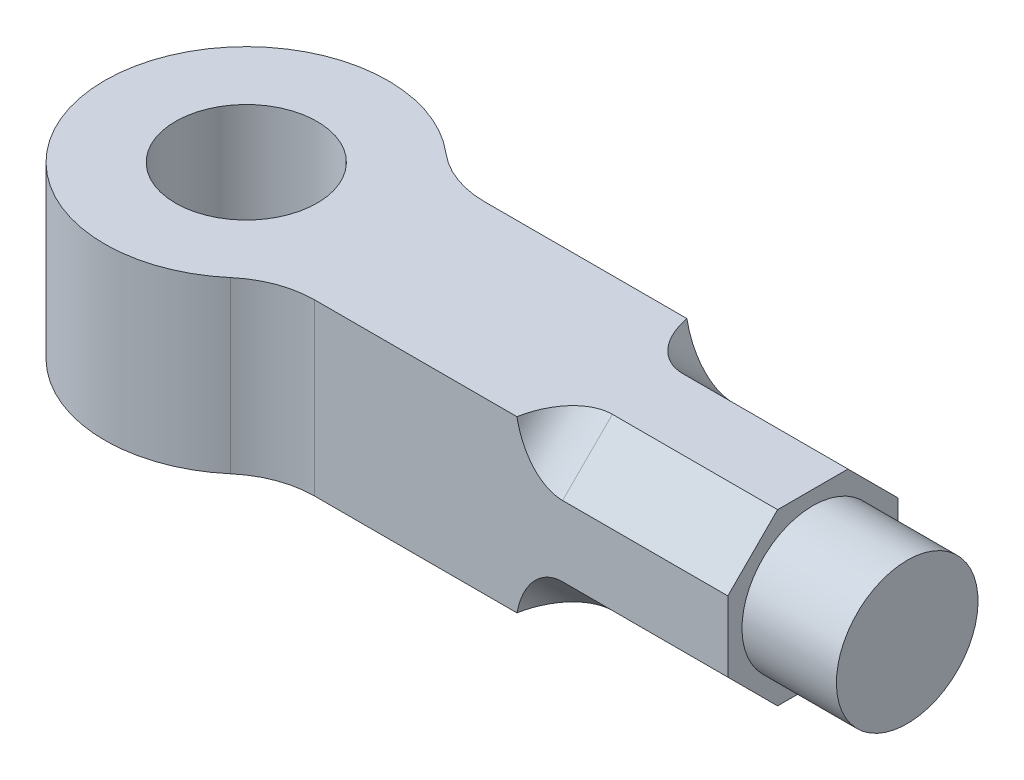
ISO-10303-21;
HEADER;
FILE_DESCRIPTION(('STEP AP214'),'2;1');
FILE_NAME('part.step','',(''),(''),'','','');
FILE_SCHEMA(('AUTOMOTIVE_DESIGN { 1 0 10303 214 1 1 1 1 }'));
ENDSEC;
DATA;
#1=APPLICATION_CONTEXT('core data for automotive mechanical design processes');
#2=APPLICATION_PROTOCOL_DEFINITION('international standard','automotive_design',2000,#1);
#3=PRODUCT_CONTEXT('',#1,'mechanical');
#4=PRODUCT('Part','Part','',(#3));
#5=PRODUCT_RELATED_PRODUCT_CATEGORY('part','',(#4));
#6=PRODUCT_DEFINITION_FORMATION('','',#4);
#7=PRODUCT_DEFINITION_CONTEXT('part definition',#1,'design');
#8=PRODUCT_DEFINITION('design','',#6,#7);
#9=PRODUCT_DEFINITION_SHAPE('','',#8);
#10=(LENGTH_UNIT() NAMED_UNIT(*) SI_UNIT(.MILLI.,.METRE.));
#11=(NAMED_UNIT(*) PLANE_ANGLE_UNIT() SI_UNIT($,.RADIAN.));
#12=(NAMED_UNIT(*) SI_UNIT($,.STERADIAN.) SOLID_ANGLE_UNIT());
#13=UNCERTAINTY_MEASURE_WITH_UNIT(LENGTH_MEASURE(1.E-05),#10,'distance_accuracy_value','');
#14=(GEOMETRIC_REPRESENTATION_CONTEXT(3) GLOBAL_UNCERTAINTY_ASSIGNED_CONTEXT((#13)) GLOBAL_UNIT_ASSIGNED_CONTEXT((#10,
#11,#12)) REPRESENTATION_CONTEXT('',''));
#15=CARTESIAN_POINT('',(0.,0.,0.));
#16=DIRECTION('',(0.,0.,1.));
#17=DIRECTION('',(1.,0.,0.));
#18=AXIS2_PLACEMENT_3D('',#15,#16,#17);
#19=CARTESIAN_POINT('',(0.,18.,0.));
#20=DIRECTION('',(0.,1.,0.));
#21=DIRECTION('',(0.,0.,1.));
#22=AXIS2_PLACEMENT_3D('',#19,#20,#21);
#23=PLANE('',#22);
#24=CARTESIAN_POINT('',(0.,18.,0.));
#25=DIRECTION('',(0.,1.,0.));
#26=DIRECTION('',(0.,0.,1.));
#27=AXIS2_PLACEMENT_3D('',#24,#25,#26);
#28=CIRCLE('',#27,30.);
#29=CARTESIAN_POINT('',(19.4976921711263,18.,-22.8));
#30=VERTEX_POINT('',#29);
#31=CARTESIAN_POINT('',(19.4976921711263,18.,22.8));
#32=VERTEX_POINT('',#31);
#33=EDGE_CURVE('E182',#30,#32,#28,.T.);
#34=ORIENTED_EDGE('',*,*,#33,.T.);
#35=CARTESIAN_POINT('',(32.4961536185439,18.,38.));
#36=DIRECTION('',(0.,1.,0.));
#37=DIRECTION('',(0.,0.,1.));
#38=AXIS2_PLACEMENT_3D('',#35,#36,#37);
#39=CIRCLE('',#38,20.);
#40=CARTESIAN_POINT('',(32.4961536185439,18.,18.));
#41=VERTEX_POINT('',#40);
#42=EDGE_CURVE('E234',#32,#41,#39,.F.);
#43=ORIENTED_EDGE('',*,*,#42,.T.);
#44=DIRECTION('',(1.,0.,0.));
#45=VECTOR('',#44,1.);
#46=CARTESIAN_POINT('',(24.,18.,18.));
#47=LINE('',#46,#45);
#48=CARTESIAN_POINT('',(75.3290501566764,18.,18.));
#49=VERTEX_POINT('',#48);
#50=EDGE_CURVE('E186',#41,#49,#47,.T.);
#51=ORIENTED_EDGE('',*,*,#50,.T.);
#52=CARTESIAN_POINT('',(85.,18.,21.5979797464467));
#53=DIRECTION('',(0.,1.,0.));
#54=DIRECTION('',(0.,0.,-1.));
#55=AXIS2_PLACEMENT_3D('',#52,#53,#54);
#56=ELLIPSE('',#55,14.1421356237309,10.);
#57=CARTESIAN_POINT('',(85.,18.,7.45584412271579));
#58=VERTEX_POINT('',#57);
#59=EDGE_CURVE('E221',#49,#58,#56,.F.);
#60=ORIENTED_EDGE('',*,*,#59,.T.);
#61=DIRECTION('',(-1.,0.,0.));
#62=VECTOR('',#61,1.);
#63=CARTESIAN_POINT('',(120.,18.,7.4558441227158));
#64=LINE('',#63,#62);
#65=CARTESIAN_POINT('',(120.,18.,7.4558441227158));
#66=VERTEX_POINT('',#65);
#67=EDGE_CURVE('E299',#66,#58,#64,.T.);
#68=ORIENTED_EDGE('',*,*,#67,.F.);
#69=DIRECTION('',(0.,0.,1.));
#70=VECTOR('',#69,1.);
#71=CARTESIAN_POINT('',(120.,18.0000000000001,-7.45584412271558));
#72=LINE('',#71,#70);
#73=CARTESIAN_POINT('',(120.,18.0000000000001,-7.45584412271558));
#74=VERTEX_POINT('',#73);
#75=EDGE_CURVE('E303',#74,#66,#72,.T.);
#76=ORIENTED_EDGE('',*,*,#75,.F.);
#77=DIRECTION('',(-1.,0.,0.));
#78=VECTOR('',#77,1.);
#79=CARTESIAN_POINT('',(120.,18.0000000000001,-7.45584412271558));
#80=LINE('',#79,#78);
#81=CARTESIAN_POINT('',(85.,18.0000000000001,-7.45584412271559));
#82=VERTEX_POINT('',#81);
#83=EDGE_CURVE('E301',#74,#82,#80,.T.);
#84=ORIENTED_EDGE('',*,*,#83,.T.);
#85=CARTESIAN_POINT('',(85.,18.,-21.5979797464467));
#86=DIRECTION('',(0.,1.,0.));
#87=DIRECTION('',(0.,0.,-1.));
#88=AXIS2_PLACEMENT_3D('',#85,#86,#87);
#89=ELLIPSE('',#88,14.142135623731,10.);
#90=CARTESIAN_POINT('',(75.3290501566765,18.,-18.));
#91=VERTEX_POINT('',#90);
#92=EDGE_CURVE('E213',#82,#91,#89,.F.);
#93=ORIENTED_EDGE('',*,*,#92,.T.);
#94=DIRECTION('',(-1.,0.,0.));
#95=VECTOR('',#94,1.);
#96=CARTESIAN_POINT('',(24.,18.,-18.));
#97=LINE('',#96,#95);
#98=CARTESIAN_POINT('',(32.4961536185438,18.,-18.));
#99=VERTEX_POINT('',#98);
#100=EDGE_CURVE('E180',#91,#99,#97,.T.);
#101=ORIENTED_EDGE('',*,*,#100,.T.);
#102=CARTESIAN_POINT('',(32.4961536185438,18.,-38.));
#103=DIRECTION('',(0.,1.,0.));
#104=DIRECTION('',(0.,0.,1.));
#105=AXIS2_PLACEMENT_3D('',#102,#103,#104);
#106=CIRCLE('',#105,20.);
#107=EDGE_CURVE('E43',#99,#30,#106,.F.);
#108=ORIENTED_EDGE('',*,*,#107,.T.);
#109=EDGE_LOOP('',(#34,#43,#51,#60,#68,#76,#84,#93,#101,#108));
#110=FACE_BOUND('',#109,.T.);
#111=CARTESIAN_POINT('',(0.,18.,0.));
#112=DIRECTION('',(0.,1.,0.));
#113=DIRECTION('',(0.,0.,1.));
#114=AXIS2_PLACEMENT_3D('',#111,#112,#113);
#115=CIRCLE('',#114,15.);
#116=CARTESIAN_POINT('',(0.,18.,15.));
#117=VERTEX_POINT('',#116);
#118=EDGE_CURVE('E171',#117,#117,#115,.T.);
#119=ORIENTED_EDGE('',*,*,#118,.F.);
#120=EDGE_LOOP('',(#119));
#121=FACE_BOUND('',#120,.T.);
#122=ADVANCED_FACE('F39',(#110,#121),#23,.T.);
#123=CARTESIAN_POINT('',(0.,-18.,0.));
#124=DIRECTION('',(0.,1.,0.));
#125=DIRECTION('',(0.,0.,1.));
#126=AXIS2_PLACEMENT_3D('',#123,#124,#125);
#127=PLANE('',#126);
#128=DIRECTION('',(-1.,0.,0.));
#129=VECTOR('',#128,1.);
#130=CARTESIAN_POINT('',(120.,-18.,7.45584412271571));
#131=LINE('',#130,#129);
#132=CARTESIAN_POINT('',(120.,-18.,7.45584412271571));
#133=VERTEX_POINT('',#132);
#134=CARTESIAN_POINT('',(85.,-18.,7.4558441227157));
#135=VERTEX_POINT('',#134);
#136=EDGE_CURVE('E149',#133,#135,#131,.T.);
#137=ORIENTED_EDGE('',*,*,#136,.T.);
#138=CARTESIAN_POINT('',(85.,-18.,21.5979797464467));
#139=DIRECTION('',(0.,1.,0.));
#140=DIRECTION('',(0.,0.,1.));
#141=AXIS2_PLACEMENT_3D('',#138,#139,#140);
#142=ELLIPSE('',#141,14.142135623731,10.);
#143=CARTESIAN_POINT('',(75.3290501566765,-18.,18.));
#144=VERTEX_POINT('',#143);
#145=EDGE_CURVE('E204',#135,#144,#142,.T.);
#146=ORIENTED_EDGE('',*,*,#145,.T.);
#147=DIRECTION('',(1.,0.,0.));
#148=VECTOR('',#147,1.);
#149=CARTESIAN_POINT('',(24.,-18.,18.));
#150=LINE('',#149,#148);
#151=CARTESIAN_POINT('',(32.4961536185439,-18.,18.));
#152=VERTEX_POINT('',#151);
#153=EDGE_CURVE('E183',#152,#144,#150,.T.);
#154=ORIENTED_EDGE('',*,*,#153,.F.);
#155=CARTESIAN_POINT('',(32.4961536185439,-18.,38.));
#156=DIRECTION('',(0.,1.,0.));
#157=DIRECTION('',(0.,0.,1.));
#158=AXIS2_PLACEMENT_3D('',#155,#156,#157);
#159=CIRCLE('',#158,20.);
#160=CARTESIAN_POINT('',(19.4976921711263,-18.,22.8));
#161=VERTEX_POINT('',#160);
#162=EDGE_CURVE('E232',#152,#161,#159,.T.);
#163=ORIENTED_EDGE('',*,*,#162,.T.);
#164=CARTESIAN_POINT('',(0.,-18.,0.));
#165=DIRECTION('',(0.,1.,0.));
#166=DIRECTION('',(0.,0.,1.));
#167=AXIS2_PLACEMENT_3D('',#164,#165,#166);
#168=CIRCLE('',#167,30.);
#169=CARTESIAN_POINT('',(19.4976921711263,-18.,-22.8));
#170=VERTEX_POINT('',#169);
#171=EDGE_CURVE('E190',#170,#161,#168,.T.);
#172=ORIENTED_EDGE('',*,*,#171,.F.);
#173=CARTESIAN_POINT('',(32.4961536185438,-18.,-38.));
#174=DIRECTION('',(0.,1.,0.));
#175=DIRECTION('',(0.,0.,1.));
#176=AXIS2_PLACEMENT_3D('',#173,#174,#175);
#177=CIRCLE('',#176,20.);
#178=CARTESIAN_POINT('',(32.4961536185438,-18.,-18.));
#179=VERTEX_POINT('',#178);
#180=EDGE_CURVE('E63',#170,#179,#177,.T.);
#181=ORIENTED_EDGE('',*,*,#180,.T.);
#182=DIRECTION('',(-1.,0.,0.));
#183=VECTOR('',#182,1.);
#184=CARTESIAN_POINT('',(24.,-18.,-18.));
#185=LINE('',#184,#183);
#186=CARTESIAN_POINT('',(75.3290501566765,-18.,-18.));
#187=VERTEX_POINT('',#186);
#188=EDGE_CURVE('E178',#187,#179,#185,.T.);
#189=ORIENTED_EDGE('',*,*,#188,.F.);
#190=CARTESIAN_POINT('',(85.,-18.,-21.5979797464466));
#191=DIRECTION('',(0.,1.,0.));
#192=DIRECTION('',(0.,0.,1.));
#193=AXIS2_PLACEMENT_3D('',#190,#191,#192);
#194=ELLIPSE('',#193,14.1421356237309,10.);
#195=CARTESIAN_POINT('',(85.,-18.,-7.45584412271578));
#196=VERTEX_POINT('',#195);
#197=EDGE_CURVE('E211',#187,#196,#194,.T.);
#198=ORIENTED_EDGE('',*,*,#197,.T.);
#199=DIRECTION('',(-1.,0.,0.));
#200=VECTOR('',#199,1.);
#201=CARTESIAN_POINT('',(120.,-18.,-7.45584412271576));
#202=LINE('',#201,#200);
#203=CARTESIAN_POINT('',(120.,-18.,-7.45584412271576));
#204=VERTEX_POINT('',#203);
#205=EDGE_CURVE('E173',#204,#196,#202,.T.);
#206=ORIENTED_EDGE('',*,*,#205,.F.);
#207=DIRECTION('',(0.,0.,-1.));
#208=VECTOR('',#207,1.);
#209=CARTESIAN_POINT('',(120.,-18.,7.45584412271571));
#210=LINE('',#209,#208);
#211=EDGE_CURVE('E152',#133,#204,#210,.T.);
#212=ORIENTED_EDGE('',*,*,#211,.F.);
#213=EDGE_LOOP('',(#137,#146,#154,#163,#172,#181,#189,#198,#206,#212));
#214=FACE_BOUND('',#213,.T.);
#215=CARTESIAN_POINT('',(0.,-18.,0.));
#216=DIRECTION('',(0.,1.,0.));
#217=DIRECTION('',(0.,0.,1.));
#218=AXIS2_PLACEMENT_3D('',#215,#216,#217);
#219=CIRCLE('',#218,15.);
#220=CARTESIAN_POINT('',(0.,-18.,15.));
#221=VERTEX_POINT('',#220);
#222=EDGE_CURVE('E168',#221,#221,#219,.T.);
#223=ORIENTED_EDGE('',*,*,#222,.T.);
#224=EDGE_LOOP('',(#223));
#225=FACE_BOUND('',#224,.T.);
#226=ADVANCED_FACE('F259',(#214,#225),#127,.F.);
#227=CARTESIAN_POINT('',(24.,18.,-18.));
#228=DIRECTION('',(0.,0.,1.));
#229=DIRECTION('',(1.,0.,0.));
#230=AXIS2_PLACEMENT_3D('',#227,#228,#229);
#231=PLANE('',#230);
#232=ORIENTED_EDGE('',*,*,#188,.T.);
#233=DIRECTION('',(0.,1.,0.));
#234=VECTOR('',#233,1.);
#235=CARTESIAN_POINT('',(32.4961536185438,18.,-18.));
#236=LINE('',#235,#234);
#237=EDGE_CURVE('E55',#179,#99,#236,.T.);
#238=ORIENTED_EDGE('',*,*,#237,.T.);
#239=ORIENTED_EDGE('',*,*,#100,.F.);
#240=CARTESIAN_POINT('',(85.,21.5979797464466,-18.));
#241=DIRECTION('',(0.,0.,1.));
#242=DIRECTION('',(0.,-1.,0.));
#243=AXIS2_PLACEMENT_3D('',#240,#241,#242);
#244=ELLIPSE('',#243,14.1421356237309,10.);
#245=CARTESIAN_POINT('',(85.,7.45584412271581,-18.));
#246=VERTEX_POINT('',#245);
#247=EDGE_CURVE('E216',#91,#246,#244,.T.);
#248=ORIENTED_EDGE('',*,*,#247,.T.);
#249=DIRECTION('',(-1.,0.,0.));
#250=VECTOR('',#249,1.);
#251=CARTESIAN_POINT('',(120.,7.45584412271581,-17.9999999999999));
#252=LINE('',#251,#250);
#253=CARTESIAN_POINT('',(120.,7.45584412271581,-17.9999999999999));
#254=VERTEX_POINT('',#253);
#255=EDGE_CURVE('E309',#254,#246,#252,.T.);
#256=ORIENTED_EDGE('',*,*,#255,.F.);
#257=DIRECTION('',(0.,1.,0.));
#258=VECTOR('',#257,1.);
#259=CARTESIAN_POINT('',(120.,-7.45584412271563,-18.));
#260=LINE('',#259,#258);
#261=CARTESIAN_POINT('',(120.,-7.45584412271563,-18.));
#262=VERTEX_POINT('',#261);
#263=EDGE_CURVE('E325',#262,#254,#260,.T.);
#264=ORIENTED_EDGE('',*,*,#263,.F.);
#265=DIRECTION('',(-1.,0.,0.));
#266=VECTOR('',#265,1.);
#267=CARTESIAN_POINT('',(120.,-7.45584412271563,-18.));
#268=LINE('',#267,#266);
#269=CARTESIAN_POINT('',(85.,-7.45584412271563,-18.));
#270=VERTEX_POINT('',#269);
#271=EDGE_CURVE('E312',#262,#270,#268,.T.);
#272=ORIENTED_EDGE('',*,*,#271,.T.);
#273=CARTESIAN_POINT('',(85.,-21.5979797464467,-18.));
#274=DIRECTION('',(0.,0.,1.));
#275=DIRECTION('',(0.,-1.,0.));
#276=AXIS2_PLACEMENT_3D('',#273,#274,#275);
#277=ELLIPSE('',#276,14.142135623731,10.);
#278=EDGE_CURVE('E208',#270,#187,#277,.T.);
#279=ORIENTED_EDGE('',*,*,#278,.T.);
#280=EDGE_LOOP('',(#232,#238,#239,#248,#256,#264,#272,#279));
#281=FACE_BOUND('',#280,.T.);
#282=ADVANCED_FACE('F265',(#281),#231,.F.);
#283=CARTESIAN_POINT('',(0.,18.,0.));
#284=DIRECTION('',(0.,-1.,0.));
#285=DIRECTION('',(0.,0.,-1.));
#286=AXIS2_PLACEMENT_3D('',#283,#284,#285);
#287=CYLINDRICAL_SURFACE('',#286,30.);
#288=ORIENTED_EDGE('',*,*,#171,.T.);
#289=DIRECTION('',(0.,-1.,0.));
#290=VECTOR('',#289,1.);
#291=CARTESIAN_POINT('',(19.4976921711263,18.,22.8));
#292=LINE('',#291,#290);
#293=EDGE_CURVE('E229',#161,#32,#292,.F.);
#294=ORIENTED_EDGE('',*,*,#293,.T.);
#295=ORIENTED_EDGE('',*,*,#33,.F.);
#296=DIRECTION('',(0.,-1.,0.));
#297=VECTOR('',#296,1.);
#298=CARTESIAN_POINT('',(19.4976921711263,18.,-22.8));
#299=LINE('',#298,#297);
#300=EDGE_CURVE('E226',#30,#170,#299,.T.);
#301=ORIENTED_EDGE('',*,*,#300,.T.);
#302=EDGE_LOOP('',(#288,#294,#295,#301));
#303=FACE_BOUND('',#302,.T.);
#304=ADVANCED_FACE('F243',(#303),#287,.T.);
#305=CARTESIAN_POINT('',(24.,18.,18.));
#306=DIRECTION('',(0.,0.,-1.));
#307=DIRECTION('',(-1.,0.,0.));
#308=AXIS2_PLACEMENT_3D('',#305,#306,#307);
#309=PLANE('',#308);
#310=ORIENTED_EDGE('',*,*,#50,.F.);
#311=DIRECTION('',(0.,1.,0.));
#312=VECTOR('',#311,1.);
#313=CARTESIAN_POINT('',(32.4961536185439,-18.,18.));
#314=LINE('',#313,#312);
#315=EDGE_CURVE('E223',#41,#152,#314,.F.);
#316=ORIENTED_EDGE('',*,*,#315,.T.);
#317=ORIENTED_EDGE('',*,*,#153,.T.);
#318=CARTESIAN_POINT('',(85.,-21.5979797464467,18.));
#319=DIRECTION('',(0.,0.,-1.));
#320=DIRECTION('',(0.,1.,0.));
#321=AXIS2_PLACEMENT_3D('',#318,#319,#320);
#322=ELLIPSE('',#321,14.1421356237309,10.);
#323=CARTESIAN_POINT('',(85.,-7.45584412271581,18.));
#324=VERTEX_POINT('',#323);
#325=EDGE_CURVE('E167',#144,#324,#322,.T.);
#326=ORIENTED_EDGE('',*,*,#325,.T.);
#327=DIRECTION('',(-1.,0.,0.));
#328=VECTOR('',#327,1.);
#329=CARTESIAN_POINT('',(120.,-7.45584412271581,18.));
#330=LINE('',#329,#328);
#331=CARTESIAN_POINT('',(120.,-7.45584412271581,18.));
#332=VERTEX_POINT('',#331);
#333=EDGE_CURVE('E146',#332,#324,#330,.T.);
#334=ORIENTED_EDGE('',*,*,#333,.F.);
#335=DIRECTION('',(0.,-1.,0.));
#336=VECTOR('',#335,1.);
#337=CARTESIAN_POINT('',(120.,7.45584412271567,18.0000000000001));
#338=LINE('',#337,#336);
#339=CARTESIAN_POINT('',(120.,7.45584412271567,18.0000000000001));
#340=VERTEX_POINT('',#339);
#341=EDGE_CURVE('E153',#340,#332,#338,.T.);
#342=ORIENTED_EDGE('',*,*,#341,.F.);
#343=DIRECTION('',(-1.,0.,0.));
#344=VECTOR('',#343,1.);
#345=CARTESIAN_POINT('',(120.,7.45584412271567,18.0000000000001));
#346=LINE('',#345,#344);
#347=CARTESIAN_POINT('',(85.,7.45584412271567,18.0000000000001));
#348=VERTEX_POINT('',#347);
#349=EDGE_CURVE('E297',#340,#348,#346,.T.);
#350=ORIENTED_EDGE('',*,*,#349,.T.);
#351=CARTESIAN_POINT('',(85.,21.5979797464467,18.));
#352=DIRECTION('',(0.,0.,-1.));
#353=DIRECTION('',(0.,1.,0.));
#354=AXIS2_PLACEMENT_3D('',#351,#352,#353);
#355=ELLIPSE('',#354,14.142135623731,10.);
#356=EDGE_CURVE('E218',#348,#49,#355,.T.);
#357=ORIENTED_EDGE('',*,*,#356,.T.);
#358=EDGE_LOOP('',(#310,#316,#317,#326,#334,#342,#350,#357));
#359=FACE_BOUND('',#358,.T.);
#360=ADVANCED_FACE('F165',(#359),#309,.F.);
#361=CARTESIAN_POINT('',(0.,18.,0.));
#362=DIRECTION('',(0.,-1.,0.));
#363=DIRECTION('',(0.,0.,-1.));
#364=AXIS2_PLACEMENT_3D('',#361,#362,#363);
#365=CYLINDRICAL_SURFACE('',#364,15.);
#366=ORIENTED_EDGE('',*,*,#118,.T.);
#367=EDGE_LOOP('',(#366));
#368=FACE_BOUND('',#367,.T.);
#369=ORIENTED_EDGE('',*,*,#222,.F.);
#370=EDGE_LOOP('',(#369));
#371=FACE_BOUND('',#370,.T.);
#372=ADVANCED_FACE('F268',(#368,#371),#365,.F.);
#373=CARTESIAN_POINT('',(120.,-7.45584412271581,18.));
#374=DIRECTION('',(0.,0.707106781186551,-0.707106781186544));
#375=DIRECTION('',(0.,0.707106781186544,0.707106781186551));
#376=AXIS2_PLACEMENT_3D('',#373,#374,#375);
#377=PLANE('',#376);
#378=ORIENTED_EDGE('',*,*,#333,.T.);
#379=DIRECTION('',(0.,-0.707106781186544,-0.707106781186551));
#380=VECTOR('',#379,1.);
#381=CARTESIAN_POINT('',(85.,-18.,7.4558441227157));
#382=LINE('',#381,#380);
#383=EDGE_CURVE('E188',#324,#135,#382,.T.);
#384=ORIENTED_EDGE('',*,*,#383,.T.);
#385=ORIENTED_EDGE('',*,*,#136,.F.);
#386=DIRECTION('',(0.,-0.707106781186544,-0.707106781186551));
#387=VECTOR('',#386,1.);
#388=CARTESIAN_POINT('',(120.,-7.45584412271581,18.));
#389=LINE('',#388,#387);
#390=EDGE_CURVE('E141',#332,#133,#389,.T.);
#391=ORIENTED_EDGE('',*,*,#390,.F.);
#392=EDGE_LOOP('',(#378,#384,#385,#391));
#393=FACE_BOUND('',#392,.T.);
#394=ADVANCED_FACE('F143',(#393),#377,.F.);
#395=CARTESIAN_POINT('',(120.,-18.,-7.45584412271576));
#396=DIRECTION('',(0.,0.707106781186544,0.707106781186551));
#397=DIRECTION('',(0.,-0.707106781186551,0.707106781186544));
#398=AXIS2_PLACEMENT_3D('',#395,#396,#397);
#399=PLANE('',#398);
#400=ORIENTED_EDGE('',*,*,#205,.T.);
#401=DIRECTION('',(0.,0.707106781186551,-0.707106781186544));
#402=VECTOR('',#401,1.);
#403=CARTESIAN_POINT('',(85.,-7.45584412271565,-18.));
#404=LINE('',#403,#402);
#405=EDGE_CURVE('E195',#196,#270,#404,.T.);
#406=ORIENTED_EDGE('',*,*,#405,.T.);
#407=ORIENTED_EDGE('',*,*,#271,.F.);
#408=DIRECTION('',(0.,0.707106781186551,-0.707106781186544));
#409=VECTOR('',#408,1.);
#410=CARTESIAN_POINT('',(120.,-18.,-7.45584412271576));
#411=LINE('',#410,#409);
#412=EDGE_CURVE('E321',#204,#262,#411,.T.);
#413=ORIENTED_EDGE('',*,*,#412,.F.);
#414=EDGE_LOOP('',(#400,#406,#407,#413));
#415=FACE_BOUND('',#414,.T.);
#416=ADVANCED_FACE('F319',(#415),#399,.F.);
#417=CARTESIAN_POINT('',(120.,7.45584412271581,-17.9999999999999));
#418=DIRECTION('',(0.,-0.707106781186551,0.707106781186544));
#419=DIRECTION('',(0.,-0.707106781186544,-0.707106781186551));
#420=AXIS2_PLACEMENT_3D('',#417,#418,#419);
#421=PLANE('',#420);
#422=ORIENTED_EDGE('',*,*,#255,.T.);
#423=DIRECTION('',(0.,0.707106781186544,0.707106781186551));
#424=VECTOR('',#423,1.);
#425=CARTESIAN_POINT('',(85.,18.,-7.45584412271566));
#426=LINE('',#425,#424);
#427=EDGE_CURVE('E198',#246,#82,#426,.T.);
#428=ORIENTED_EDGE('',*,*,#427,.T.);
#429=ORIENTED_EDGE('',*,*,#83,.F.);
#430=DIRECTION('',(0.,0.707106781186544,0.707106781186551));
#431=VECTOR('',#430,1.);
#432=CARTESIAN_POINT('',(120.,7.45584412271581,-17.9999999999999));
#433=LINE('',#432,#431);
#434=EDGE_CURVE('E327',#254,#74,#433,.T.);
#435=ORIENTED_EDGE('',*,*,#434,.F.);
#436=EDGE_LOOP('',(#422,#428,#429,#435));
#437=FACE_BOUND('',#436,.T.);
#438=ADVANCED_FACE('F348',(#437),#421,.F.);
#439=CARTESIAN_POINT('',(120.,18.,7.4558441227158));
#440=DIRECTION('',(0.,-0.707106781186546,-0.707106781186549));
#441=DIRECTION('',(0.,0.707106781186549,-0.707106781186546));
#442=AXIS2_PLACEMENT_3D('',#439,#440,#441);
#443=PLANE('',#442);
#444=ORIENTED_EDGE('',*,*,#67,.T.);
#445=DIRECTION('',(0.,-0.707106781186549,0.707106781186546));
#446=VECTOR('',#445,1.);
#447=CARTESIAN_POINT('',(85.,7.45584412271572,18.));
#448=LINE('',#447,#446);
#449=EDGE_CURVE('E201',#58,#348,#448,.T.);
#450=ORIENTED_EDGE('',*,*,#449,.T.);
#451=ORIENTED_EDGE('',*,*,#349,.F.);
#452=DIRECTION('',(0.,-0.707106781186549,0.707106781186546));
#453=VECTOR('',#452,1.);
#454=CARTESIAN_POINT('',(120.,18.,7.4558441227158));
#455=LINE('',#454,#453);
#456=EDGE_CURVE('E158',#66,#340,#455,.T.);
#457=ORIENTED_EDGE('',*,*,#456,.F.);
#458=EDGE_LOOP('',(#444,#450,#451,#457));
#459=FACE_BOUND('',#458,.T.);
#460=ADVANCED_FACE('F296',(#459),#443,.F.);
#461=CARTESIAN_POINT('',(120.,0.,0.));
#462=DIRECTION('',(1.,0.,0.));
#463=DIRECTION('',(0.,1.,0.));
#464=AXIS2_PLACEMENT_3D('',#461,#462,#463);
#465=PLANE('',#464);
#466=CARTESIAN_POINT('',(120.,1.11679811804538E-13,0.));
#467=DIRECTION('',(1.,0.,0.));
#468=DIRECTION('',(0.,1.,0.));
#469=AXIS2_PLACEMENT_3D('',#466,#467,#468);
#470=CIRCLE('',#469,15.);
#471=CARTESIAN_POINT('',(120.,15.0000000000001,0.));
#472=VERTEX_POINT('',#471);
#473=EDGE_CURVE('E11',#472,#472,#470,.T.);
#474=ORIENTED_EDGE('',*,*,#473,.F.);
#475=EDGE_LOOP('',(#474));
#476=FACE_BOUND('',#475,.T.);
#477=ORIENTED_EDGE('',*,*,#341,.T.);
#478=ORIENTED_EDGE('',*,*,#390,.T.);
#479=ORIENTED_EDGE('',*,*,#211,.T.);
#480=ORIENTED_EDGE('',*,*,#412,.T.);
#481=ORIENTED_EDGE('',*,*,#263,.T.);
#482=ORIENTED_EDGE('',*,*,#434,.T.);
#483=ORIENTED_EDGE('',*,*,#75,.T.);
#484=ORIENTED_EDGE('',*,*,#456,.T.);
#485=EDGE_LOOP('',(#477,#478,#479,#480,#481,#482,#483,#484));
#486=FACE_BOUND('',#485,.T.);
#487=ADVANCED_FACE('F156',(#476,#486),#465,.T.);
#488=CARTESIAN_POINT('',(85.,-14.5269119345813,25.0710678118655));
#489=DIRECTION('',(0.,0.707106781186544,0.707106781186551));
#490=DIRECTION('',(0.,-0.707106781186551,0.707106781186544));
#491=AXIS2_PLACEMENT_3D('',#488,#489,#490);
#492=CYLINDRICAL_SURFACE('',#491,10.);
#493=ORIENTED_EDGE('',*,*,#383,.F.);
#494=ORIENTED_EDGE('',*,*,#325,.F.);
#495=ORIENTED_EDGE('',*,*,#145,.F.);
#496=EDGE_LOOP('',(#493,#494,#495));
#497=FACE_BOUND('',#496,.T.);
#498=ADVANCED_FACE('F277',(#497),#492,.F.);
#499=CARTESIAN_POINT('',(85.,-25.0710678118654,-14.5269119345813));
#500=DIRECTION('',(0.,-0.707106781186551,0.707106781186544));
#501=DIRECTION('',(0.,-0.707106781186544,-0.707106781186551));
#502=AXIS2_PLACEMENT_3D('',#499,#500,#501);
#503=CYLINDRICAL_SURFACE('',#502,10.);
#504=ORIENTED_EDGE('',*,*,#405,.F.);
#505=ORIENTED_EDGE('',*,*,#197,.F.);
#506=ORIENTED_EDGE('',*,*,#278,.F.);
#507=EDGE_LOOP('',(#504,#505,#506));
#508=FACE_BOUND('',#507,.T.);
#509=ADVANCED_FACE('F280',(#508),#503,.F.);
#510=CARTESIAN_POINT('',(85.,14.5269119345813,-25.0710678118654));
#511=DIRECTION('',(0.,-0.707106781186544,-0.707106781186551));
#512=DIRECTION('',(0.,0.707106781186551,-0.707106781186544));
#513=AXIS2_PLACEMENT_3D('',#510,#511,#512);
#514=CYLINDRICAL_SURFACE('',#513,10.);
#515=ORIENTED_EDGE('',*,*,#427,.F.);
#516=ORIENTED_EDGE('',*,*,#247,.F.);
#517=ORIENTED_EDGE('',*,*,#92,.F.);
#518=EDGE_LOOP('',(#515,#516,#517));
#519=FACE_BOUND('',#518,.T.);
#520=ADVANCED_FACE('F284',(#519),#514,.F.);
#521=CARTESIAN_POINT('',(85.,25.0710678118654,14.5269119345813));
#522=DIRECTION('',(0.,0.707106781186549,-0.707106781186546));
#523=DIRECTION('',(0.,0.707106781186546,0.707106781186549));
#524=AXIS2_PLACEMENT_3D('',#521,#522,#523);
#525=CYLINDRICAL_SURFACE('',#524,10.);
#526=ORIENTED_EDGE('',*,*,#449,.F.);
#527=ORIENTED_EDGE('',*,*,#59,.F.);
#528=ORIENTED_EDGE('',*,*,#356,.F.);
#529=EDGE_LOOP('',(#526,#527,#528));
#530=FACE_BOUND('',#529,.T.);
#531=ADVANCED_FACE('F256',(#530),#525,.F.);
#532=CARTESIAN_POINT('',(32.4961536185439,18.,38.));
#533=DIRECTION('',(0.,-1.,0.));
#534=DIRECTION('',(0.,0.,-1.));
#535=AXIS2_PLACEMENT_3D('',#532,#533,#534);
#536=CYLINDRICAL_SURFACE('',#535,20.);
#537=ORIENTED_EDGE('',*,*,#42,.F.);
#538=ORIENTED_EDGE('',*,*,#293,.F.);
#539=ORIENTED_EDGE('',*,*,#162,.F.);
#540=ORIENTED_EDGE('',*,*,#315,.F.);
#541=EDGE_LOOP('',(#537,#538,#539,#540));
#542=FACE_BOUND('',#541,.T.);
#543=ADVANCED_FACE('F247',(#542),#536,.F.);
#544=CARTESIAN_POINT('',(32.4961536185438,18.,-38.));
#545=DIRECTION('',(0.,-1.,0.));
#546=DIRECTION('',(0.,0.,-1.));
#547=AXIS2_PLACEMENT_3D('',#544,#545,#546);
#548=CYLINDRICAL_SURFACE('',#547,20.);
#549=ORIENTED_EDGE('',*,*,#107,.F.);
#550=ORIENTED_EDGE('',*,*,#237,.F.);
#551=ORIENTED_EDGE('',*,*,#180,.F.);
#552=ORIENTED_EDGE('',*,*,#300,.F.);
#553=EDGE_LOOP('',(#549,#550,#551,#552));
#554=FACE_BOUND('',#553,.T.);
#555=ADVANCED_FACE('F41',(#554),#548,.F.);
#556=CARTESIAN_POINT('',(140.,1.30293113771961E-13,0.));
#557=DIRECTION('',(-1.,0.,0.));
#558=DIRECTION('',(0.,-1.,0.));
#559=AXIS2_PLACEMENT_3D('',#556,#557,#558);
#560=CYLINDRICAL_SURFACE('',#559,15.);
#561=CARTESIAN_POINT('',(140.,1.30293113771961E-13,0.));
#562=DIRECTION('',(1.,0.,0.));
#563=DIRECTION('',(0.,1.,0.));
#564=AXIS2_PLACEMENT_3D('',#561,#562,#563);
#565=CIRCLE('',#564,15.);
#566=CARTESIAN_POINT('',(140.,15.0000000000001,0.));
#567=VERTEX_POINT('',#566);
#568=EDGE_CURVE('E162',#567,#567,#565,.T.);
#569=ORIENTED_EDGE('',*,*,#568,.F.);
#570=EDGE_LOOP('',(#569));
#571=FACE_BOUND('',#570,.T.);
#572=ORIENTED_EDGE('',*,*,#473,.T.);
#573=EDGE_LOOP('',(#572));
#574=FACE_BOUND('',#573,.T.);
#575=ADVANCED_FACE('F246',(#571,#574),#560,.T.);
#576=CARTESIAN_POINT('',(140.,1.30293113771961E-13,0.));
#577=DIRECTION('',(1.,0.,0.));
#578=DIRECTION('',(0.,1.,0.));
#579=AXIS2_PLACEMENT_3D('',#576,#577,#578);
#580=PLANE('',#579);
#581=ORIENTED_EDGE('',*,*,#568,.T.);
#582=EDGE_LOOP('',(#581));
#583=FACE_BOUND('',#582,.T.);
#584=ADVANCED_FACE('F253',(#583),#580,.T.);
#585=CLOSED_SHELL('',(#122,#226,#282,#304,#360,#372,#394,#416,#438,#460,#487,#498,#509,#520,
#531,#543,#555,#575,#584));
#586=MANIFOLD_SOLID_BREP('B2',#585);
#587=ADVANCED_BREP_SHAPE_REPRESENTATION('',(#18,#586),#14);
#588=SHAPE_DEFINITION_REPRESENTATION(#9,#587);
ENDSEC;
END-ISO-10303-21;
